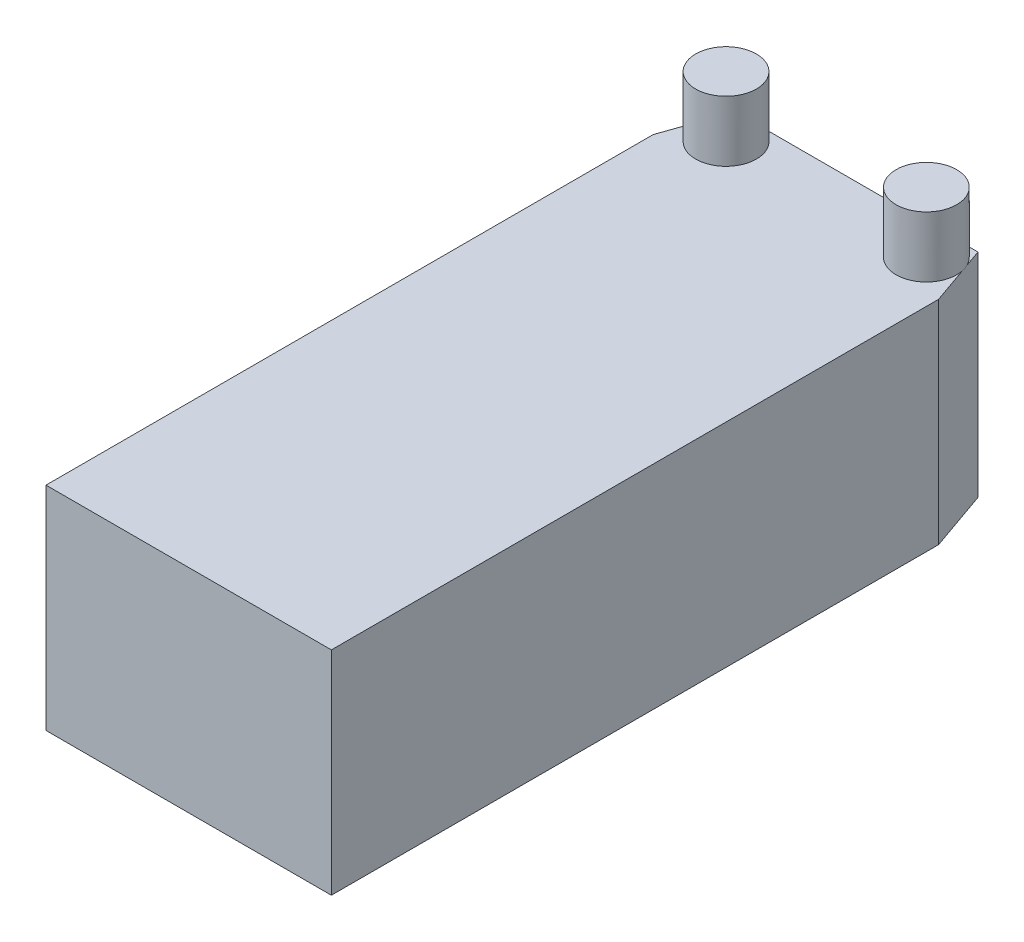
ISO-10303-21;
HEADER;
FILE_DESCRIPTION(('STEP AP214'),'2;1');
FILE_NAME('part.step','',(''),(''),'','','');
FILE_SCHEMA(('AUTOMOTIVE_DESIGN { 1 0 10303 214 1 1 1 1 }'));
ENDSEC;
DATA;
#1=APPLICATION_CONTEXT('core data for automotive mechanical design processes');
#2=APPLICATION_PROTOCOL_DEFINITION('international standard','automotive_design',2000,#1);
#3=PRODUCT_CONTEXT('',#1,'mechanical');
#4=PRODUCT('Part','Part','',(#3));
#5=PRODUCT_RELATED_PRODUCT_CATEGORY('part','',(#4));
#6=PRODUCT_DEFINITION_FORMATION('','',#4);
#7=PRODUCT_DEFINITION_CONTEXT('part definition',#1,'design');
#8=PRODUCT_DEFINITION('design','',#6,#7);
#9=PRODUCT_DEFINITION_SHAPE('','',#8);
#10=(LENGTH_UNIT() NAMED_UNIT(*) SI_UNIT(.MILLI.,.METRE.));
#11=(NAMED_UNIT(*) PLANE_ANGLE_UNIT() SI_UNIT($,.RADIAN.));
#12=(NAMED_UNIT(*) SI_UNIT($,.STERADIAN.) SOLID_ANGLE_UNIT());
#13=UNCERTAINTY_MEASURE_WITH_UNIT(LENGTH_MEASURE(1.E-05),#10,'distance_accuracy_value','');
#14=(GEOMETRIC_REPRESENTATION_CONTEXT(3) GLOBAL_UNCERTAINTY_ASSIGNED_CONTEXT((#13)) GLOBAL_UNIT_ASSIGNED_CONTEXT((#10,
#11,#12)) REPRESENTATION_CONTEXT('',''));
#15=CARTESIAN_POINT('',(0.,0.,0.));
#16=DIRECTION('',(0.,0.,1.));
#17=DIRECTION('',(1.,0.,0.));
#18=AXIS2_PLACEMENT_3D('',#15,#16,#17);
#19=CARTESIAN_POINT('',(0.,35.,0.));
#20=DIRECTION('',(0.,1.,0.));
#21=DIRECTION('',(0.,0.,1.));
#22=AXIS2_PLACEMENT_3D('',#19,#20,#21);
#23=PLANE('',#22);
#24=DIRECTION('',(-1.,0.,0.));
#25=VECTOR('',#24,1.);
#26=CARTESIAN_POINT('',(-20.,35.,-60.));
#27=LINE('',#26,#25);
#28=CARTESIAN_POINT('',(20.,35.,-60.));
#29=VERTEX_POINT('',#28);
#30=CARTESIAN_POINT('',(16.5,35.,-60.));
#31=VERTEX_POINT('',#30);
#32=EDGE_CURVE('E130',#29,#31,#27,.T.);
#33=ORIENTED_EDGE('',*,*,#32,.T.);
#34=CARTESIAN_POINT('',(16.5,35.,-55.));
#35=DIRECTION('',(0.,1.,0.));
#36=DIRECTION('',(0.,0.,1.));
#37=AXIS2_PLACEMENT_3D('',#34,#35,#36);
#38=CIRCLE('',#37,5.);
#39=CARTESIAN_POINT('',(20.9565814045298,35.,-57.266910272772));
#40=VERTEX_POINT('',#39);
#41=EDGE_CURVE('E11',#31,#40,#38,.F.);
#42=ORIENTED_EDGE('',*,*,#41,.T.);
#43=DIRECTION('',(-0.330350424728106,0.,-0.943858356366017));
#44=VECTOR('',#43,1.);
#45=CARTESIAN_POINT('',(20.,35.,-60.));
#46=LINE('',#45,#44);
#47=EDGE_CURVE('E121',#40,#29,#46,.T.);
#48=ORIENTED_EDGE('',*,*,#47,.T.);
#49=EDGE_LOOP('',(#33,#42,#48));
#50=FACE_BOUND('',#49,.T.);
#51=ADVANCED_FACE('F36',(#50),#23,.T.);
#52=CARTESIAN_POINT('',(-16.5,35.,-55.));
#53=DIRECTION('',(0.,1.,0.));
#54=DIRECTION('',(0.,0.,1.));
#55=AXIS2_PLACEMENT_3D('',#52,#53,#54);
#56=CIRCLE('',#55,5.);
#57=CARTESIAN_POINT('',(-16.5,35.,-60.));
#58=VERTEX_POINT('',#57);
#59=CARTESIAN_POINT('',(-20.9565814045298,35.,-57.266910272772));
#60=VERTEX_POINT('',#59);
#61=EDGE_CURVE('E160',#58,#60,#56,.T.);
#62=ORIENTED_EDGE('',*,*,#61,.F.);
#63=CARTESIAN_POINT('',(-20.,35.,-60.));
#64=VERTEX_POINT('',#63);
#65=EDGE_CURVE('E127',#58,#64,#27,.T.);
#66=ORIENTED_EDGE('',*,*,#65,.T.);
#67=DIRECTION('',(-0.330350424728106,0.,0.943858356366017));
#68=VECTOR('',#67,1.);
#69=CARTESIAN_POINT('',(-23.5,35.,-50.));
#70=LINE('',#69,#68);
#71=EDGE_CURVE('E206',#64,#60,#70,.T.);
#72=ORIENTED_EDGE('',*,*,#71,.T.);
#73=EDGE_LOOP('',(#62,#66,#72));
#74=FACE_BOUND('',#73,.T.);
#75=ADVANCED_FACE('F215',(#74),#23,.T.);
#76=CARTESIAN_POINT('',(20.,35.,-60.));
#77=DIRECTION('',(-0.943858356366017,0.,0.330350424728106));
#78=DIRECTION('',(0.330350424728106,0.,0.943858356366018));
#79=AXIS2_PLACEMENT_3D('',#76,#77,#78);
#80=PLANE('',#79);
#81=DIRECTION('',(-0.330350424728106,0.,-0.943858356366017));
#82=VECTOR('',#81,1.);
#83=CARTESIAN_POINT('',(20.,0.,-60.));
#84=LINE('',#83,#82);
#85=CARTESIAN_POINT('',(23.5,0.,-50.));
#86=VERTEX_POINT('',#85);
#87=CARTESIAN_POINT('',(20.,0.,-60.));
#88=VERTEX_POINT('',#87);
#89=EDGE_CURVE('E173',#86,#88,#84,.T.);
#90=ORIENTED_EDGE('',*,*,#89,.T.);
#91=DIRECTION('',(0.,-1.,0.));
#92=VECTOR('',#91,1.);
#93=CARTESIAN_POINT('',(20.,35.,-60.));
#94=LINE('',#93,#92);
#95=EDGE_CURVE('E157',#29,#88,#94,.T.);
#96=ORIENTED_EDGE('',*,*,#95,.F.);
#97=ORIENTED_EDGE('',*,*,#47,.F.);
#98=CARTESIAN_POINT('',(21.3975388627308,35.,-56.0070318207692));
#99=VERTEX_POINT('',#98);
#100=EDGE_CURVE('E111',#99,#40,#46,.T.);
#101=ORIENTED_EDGE('',*,*,#100,.F.);
#102=CARTESIAN_POINT('',(23.5,35.,-50.));
#103=VERTEX_POINT('',#102);
#104=EDGE_CURVE('E119',#103,#99,#46,.T.);
#105=ORIENTED_EDGE('',*,*,#104,.F.);
#106=DIRECTION('',(0.,-1.,0.));
#107=VECTOR('',#106,1.);
#108=CARTESIAN_POINT('',(23.5,35.,-50.));
#109=LINE('',#108,#107);
#110=EDGE_CURVE('E145',#103,#86,#109,.T.);
#111=ORIENTED_EDGE('',*,*,#110,.T.);
#112=EDGE_LOOP('',(#90,#96,#97,#101,#105,#111));
#113=FACE_BOUND('',#112,.T.);
#114=ADVANCED_FACE('F38',(#113),#80,.F.);
#115=CARTESIAN_POINT('',(-20.,35.,-60.));
#116=DIRECTION('',(0.,0.,1.));
#117=DIRECTION('',(1.,0.,0.));
#118=AXIS2_PLACEMENT_3D('',#115,#116,#117);
#119=PLANE('',#118);
#120=DIRECTION('',(-1.,0.,0.));
#121=VECTOR('',#120,1.);
#122=CARTESIAN_POINT('',(-20.,0.,-60.));
#123=LINE('',#122,#121);
#124=CARTESIAN_POINT('',(-20.,0.,-60.));
#125=VERTEX_POINT('',#124);
#126=EDGE_CURVE('E176',#88,#125,#123,.T.);
#127=ORIENTED_EDGE('',*,*,#126,.T.);
#128=DIRECTION('',(0.,-1.,0.));
#129=VECTOR('',#128,1.);
#130=CARTESIAN_POINT('',(-20.,35.,-60.));
#131=LINE('',#130,#129);
#132=EDGE_CURVE('E155',#64,#125,#131,.T.);
#133=ORIENTED_EDGE('',*,*,#132,.F.);
#134=ORIENTED_EDGE('',*,*,#65,.F.);
#135=EDGE_CURVE('E128',#31,#58,#27,.T.);
#136=ORIENTED_EDGE('',*,*,#135,.F.);
#137=ORIENTED_EDGE('',*,*,#32,.F.);
#138=ORIENTED_EDGE('',*,*,#95,.T.);
#139=EDGE_LOOP('',(#127,#133,#134,#136,#137,#138));
#140=FACE_BOUND('',#139,.T.);
#141=ADVANCED_FACE('F200',(#140),#119,.F.);
#142=CARTESIAN_POINT('',(-23.5,35.,-50.));
#143=DIRECTION('',(0.943858356366017,0.,0.330350424728106));
#144=DIRECTION('',(0.330350424728106,0.,-0.943858356366018));
#145=AXIS2_PLACEMENT_3D('',#142,#143,#144);
#146=PLANE('',#145);
#147=DIRECTION('',(-0.330350424728106,0.,0.943858356366017));
#148=VECTOR('',#147,1.);
#149=CARTESIAN_POINT('',(-23.5,0.,-50.));
#150=LINE('',#149,#148);
#151=CARTESIAN_POINT('',(-23.5,0.,-50.));
#152=VERTEX_POINT('',#151);
#153=EDGE_CURVE('E179',#125,#152,#150,.T.);
#154=ORIENTED_EDGE('',*,*,#153,.T.);
#155=DIRECTION('',(0.,-1.,0.));
#156=VECTOR('',#155,1.);
#157=CARTESIAN_POINT('',(-23.5,35.,-50.));
#158=LINE('',#157,#156);
#159=CARTESIAN_POINT('',(-23.5,35.,-50.));
#160=VERTEX_POINT('',#159);
#161=EDGE_CURVE('E152',#160,#152,#158,.T.);
#162=ORIENTED_EDGE('',*,*,#161,.F.);
#163=CARTESIAN_POINT('',(-21.3975388627308,35.,-56.0070318207692));
#164=VERTEX_POINT('',#163);
#165=EDGE_CURVE('E213',#164,#160,#70,.T.);
#166=ORIENTED_EDGE('',*,*,#165,.F.);
#167=EDGE_CURVE('E208',#60,#164,#70,.T.);
#168=ORIENTED_EDGE('',*,*,#167,.F.);
#169=ORIENTED_EDGE('',*,*,#71,.F.);
#170=ORIENTED_EDGE('',*,*,#132,.T.);
#171=EDGE_LOOP('',(#154,#162,#166,#168,#169,#170));
#172=FACE_BOUND('',#171,.T.);
#173=ADVANCED_FACE('F204',(#172),#146,.F.);
#174=CARTESIAN_POINT('',(-23.5,35.,50.));
#175=DIRECTION('',(1.,0.,0.));
#176=DIRECTION('',(0.,0.,-1.));
#177=AXIS2_PLACEMENT_3D('',#174,#175,#176);
#178=PLANE('',#177);
#179=DIRECTION('',(0.,0.,1.));
#180=VECTOR('',#179,1.);
#181=CARTESIAN_POINT('',(-23.5,0.,50.));
#182=LINE('',#181,#180);
#183=CARTESIAN_POINT('',(-23.5,0.,50.));
#184=VERTEX_POINT('',#183);
#185=EDGE_CURVE('E141',#152,#184,#182,.T.);
#186=ORIENTED_EDGE('',*,*,#185,.T.);
#187=DIRECTION('',(0.,-1.,0.));
#188=VECTOR('',#187,1.);
#189=CARTESIAN_POINT('',(-23.5,35.,50.));
#190=LINE('',#189,#188);
#191=CARTESIAN_POINT('',(-23.5,35.,50.));
#192=VERTEX_POINT('',#191);
#193=EDGE_CURVE('E149',#192,#184,#190,.T.);
#194=ORIENTED_EDGE('',*,*,#193,.F.);
#195=DIRECTION('',(0.,0.,1.));
#196=VECTOR('',#195,1.);
#197=CARTESIAN_POINT('',(-23.5,35.,50.));
#198=LINE('',#197,#196);
#199=EDGE_CURVE('E211',#160,#192,#198,.T.);
#200=ORIENTED_EDGE('',*,*,#199,.F.);
#201=ORIENTED_EDGE('',*,*,#161,.T.);
#202=EDGE_LOOP('',(#186,#194,#200,#201));
#203=FACE_BOUND('',#202,.T.);
#204=ADVANCED_FACE('F187',(#203),#178,.F.);
#205=CARTESIAN_POINT('',(-23.5,35.,50.));
#206=DIRECTION('',(0.,0.,-1.));
#207=DIRECTION('',(-1.,0.,0.));
#208=AXIS2_PLACEMENT_3D('',#205,#206,#207);
#209=PLANE('',#208);
#210=DIRECTION('',(1.,0.,0.));
#211=VECTOR('',#210,1.);
#212=CARTESIAN_POINT('',(-23.5,0.,50.));
#213=LINE('',#212,#211);
#214=CARTESIAN_POINT('',(23.5,0.,50.));
#215=VERTEX_POINT('',#214);
#216=EDGE_CURVE('E136',#184,#215,#213,.T.);
#217=ORIENTED_EDGE('',*,*,#216,.T.);
#218=DIRECTION('',(0.,-1.,0.));
#219=VECTOR('',#218,1.);
#220=CARTESIAN_POINT('',(23.5,35.,50.));
#221=LINE('',#220,#219);
#222=CARTESIAN_POINT('',(23.5,35.,50.));
#223=VERTEX_POINT('',#222);
#224=EDGE_CURVE('E147',#223,#215,#221,.T.);
#225=ORIENTED_EDGE('',*,*,#224,.F.);
#226=DIRECTION('',(1.,0.,0.));
#227=VECTOR('',#226,1.);
#228=CARTESIAN_POINT('',(-23.5,35.,50.));
#229=LINE('',#228,#227);
#230=EDGE_CURVE('E197',#192,#223,#229,.T.);
#231=ORIENTED_EDGE('',*,*,#230,.F.);
#232=ORIENTED_EDGE('',*,*,#193,.T.);
#233=EDGE_LOOP('',(#217,#225,#231,#232));
#234=FACE_BOUND('',#233,.T.);
#235=ADVANCED_FACE('F195',(#234),#209,.F.);
#236=CARTESIAN_POINT('',(23.5,35.,50.));
#237=DIRECTION('',(-1.,0.,0.));
#238=DIRECTION('',(0.,0.,1.));
#239=AXIS2_PLACEMENT_3D('',#236,#237,#238);
#240=PLANE('',#239);
#241=DIRECTION('',(0.,0.,-1.));
#242=VECTOR('',#241,1.);
#243=CARTESIAN_POINT('',(23.5,0.,50.));
#244=LINE('',#243,#242);
#245=EDGE_CURVE('E132',#215,#86,#244,.T.);
#246=ORIENTED_EDGE('',*,*,#245,.T.);
#247=ORIENTED_EDGE('',*,*,#110,.F.);
#248=DIRECTION('',(0.,0.,-1.));
#249=VECTOR('',#248,1.);
#250=CARTESIAN_POINT('',(23.5,35.,50.));
#251=LINE('',#250,#249);
#252=EDGE_CURVE('E125',#223,#103,#251,.T.);
#253=ORIENTED_EDGE('',*,*,#252,.F.);
#254=ORIENTED_EDGE('',*,*,#224,.T.);
#255=EDGE_LOOP('',(#246,#247,#253,#254));
#256=FACE_BOUND('',#255,.T.);
#257=ADVANCED_FACE('F236',(#256),#240,.F.);
#258=ORIENTED_EDGE('',*,*,#104,.T.);
#259=EDGE_CURVE('E40',#99,#31,#38,.F.);
#260=ORIENTED_EDGE('',*,*,#259,.T.);
#261=ORIENTED_EDGE('',*,*,#135,.T.);
#262=EDGE_CURVE('E57',#164,#58,#56,.T.);
#263=ORIENTED_EDGE('',*,*,#262,.F.);
#264=ORIENTED_EDGE('',*,*,#165,.T.);
#265=ORIENTED_EDGE('',*,*,#199,.T.);
#266=ORIENTED_EDGE('',*,*,#230,.T.);
#267=ORIENTED_EDGE('',*,*,#252,.T.);
#268=EDGE_LOOP('',(#258,#260,#261,#263,#264,#265,#266,#267));
#269=FACE_BOUND('',#268,.T.);
#270=ADVANCED_FACE('F123',(#269),#23,.T.);
#271=CARTESIAN_POINT('',(0.,0.,0.));
#272=DIRECTION('',(0.,1.,0.));
#273=DIRECTION('',(0.,0.,1.));
#274=AXIS2_PLACEMENT_3D('',#271,#272,#273);
#275=PLANE('',#274);
#276=ORIENTED_EDGE('',*,*,#89,.F.);
#277=ORIENTED_EDGE('',*,*,#245,.F.);
#278=ORIENTED_EDGE('',*,*,#216,.F.);
#279=ORIENTED_EDGE('',*,*,#185,.F.);
#280=ORIENTED_EDGE('',*,*,#153,.F.);
#281=ORIENTED_EDGE('',*,*,#126,.F.);
#282=EDGE_LOOP('',(#276,#277,#278,#279,#280,#281));
#283=FACE_BOUND('',#282,.T.);
#284=ADVANCED_FACE('F198',(#283),#275,.F.);
#285=CARTESIAN_POINT('',(-16.5,35.,-55.));
#286=DIRECTION('',(0.,1.,0.));
#287=DIRECTION('',(0.,0.,1.));
#288=AXIS2_PLACEMENT_3D('',#285,#286,#287);
#289=PLANE('',#288);
#290=EDGE_CURVE('E161',#60,#164,#56,.T.);
#291=ORIENTED_EDGE('',*,*,#290,.F.);
#292=ORIENTED_EDGE('',*,*,#167,.T.);
#293=EDGE_LOOP('',(#291,#292));
#294=FACE_BOUND('',#293,.T.);
#295=ADVANCED_FACE('F219',(#294),#289,.F.);
#296=CARTESIAN_POINT('',(-16.5,45.,-55.));
#297=DIRECTION('',(0.,-1.,0.));
#298=DIRECTION('',(0.,0.,-1.));
#299=AXIS2_PLACEMENT_3D('',#296,#297,#298);
#300=CYLINDRICAL_SURFACE('',#299,5.);
#301=CARTESIAN_POINT('',(-16.5,45.,-55.));
#302=DIRECTION('',(0.,1.,0.));
#303=DIRECTION('',(0.,0.,1.));
#304=AXIS2_PLACEMENT_3D('',#301,#302,#303);
#305=CIRCLE('',#304,5.);
#306=CARTESIAN_POINT('',(-16.5,45.,-50.));
#307=VERTEX_POINT('',#306);
#308=EDGE_CURVE('E166',#307,#307,#305,.T.);
#309=ORIENTED_EDGE('',*,*,#308,.F.);
#310=EDGE_LOOP('',(#309));
#311=FACE_BOUND('',#310,.T.);
#312=ORIENTED_EDGE('',*,*,#61,.T.);
#313=ORIENTED_EDGE('',*,*,#290,.T.);
#314=ORIENTED_EDGE('',*,*,#262,.T.);
#315=EDGE_LOOP('',(#312,#313,#314));
#316=FACE_BOUND('',#315,.T.);
#317=ADVANCED_FACE('F216',(#311,#316),#300,.T.);
#318=CARTESIAN_POINT('',(-16.5,45.,-55.));
#319=DIRECTION('',(0.,1.,0.));
#320=DIRECTION('',(0.,0.,1.));
#321=AXIS2_PLACEMENT_3D('',#318,#319,#320);
#322=PLANE('',#321);
#323=ORIENTED_EDGE('',*,*,#308,.T.);
#324=EDGE_LOOP('',(#323));
#325=FACE_BOUND('',#324,.T.);
#326=ADVANCED_FACE('F218',(#325),#322,.T.);
#327=CARTESIAN_POINT('',(16.5,35.,-55.));
#328=DIRECTION('',(0.,1.,0.));
#329=DIRECTION('',(0.,0.,1.));
#330=AXIS2_PLACEMENT_3D('',#327,#328,#329);
#331=PLANE('',#330);
#332=CARTESIAN_POINT('',(16.5,35.,-55.));
#333=DIRECTION('',(0.,1.,0.));
#334=DIRECTION('',(0.,0.,1.));
#335=AXIS2_PLACEMENT_3D('',#332,#333,#334);
#336=CIRCLE('',#335,5.);
#337=EDGE_CURVE('E105',#99,#40,#336,.T.);
#338=ORIENTED_EDGE('',*,*,#337,.F.);
#339=ORIENTED_EDGE('',*,*,#100,.T.);
#340=EDGE_LOOP('',(#338,#339));
#341=FACE_BOUND('',#340,.T.);
#342=ADVANCED_FACE('F110',(#341),#331,.F.);
#343=CARTESIAN_POINT('',(16.5,45.,-55.));
#344=DIRECTION('',(0.,-1.,0.));
#345=DIRECTION('',(0.,0.,-1.));
#346=AXIS2_PLACEMENT_3D('',#343,#344,#345);
#347=CYLINDRICAL_SURFACE('',#346,5.);
#348=CARTESIAN_POINT('',(16.5,45.,-55.));
#349=DIRECTION('',(0.,1.,0.));
#350=DIRECTION('',(0.,0.,1.));
#351=AXIS2_PLACEMENT_3D('',#348,#349,#350);
#352=CIRCLE('',#351,5.);
#353=CARTESIAN_POINT('',(16.5,45.,-50.));
#354=VERTEX_POINT('',#353);
#355=EDGE_CURVE('E112',#354,#354,#352,.T.);
#356=ORIENTED_EDGE('',*,*,#355,.F.);
#357=EDGE_LOOP('',(#356));
#358=FACE_BOUND('',#357,.T.);
#359=ORIENTED_EDGE('',*,*,#337,.T.);
#360=ORIENTED_EDGE('',*,*,#41,.F.);
#361=ORIENTED_EDGE('',*,*,#259,.F.);
#362=EDGE_LOOP('',(#359,#360,#361));
#363=FACE_BOUND('',#362,.T.);
#364=ADVANCED_FACE('F104',(#358,#363),#347,.T.);
#365=CARTESIAN_POINT('',(16.5,45.,-55.));
#366=DIRECTION('',(0.,1.,0.));
#367=DIRECTION('',(0.,0.,1.));
#368=AXIS2_PLACEMENT_3D('',#365,#366,#367);
#369=PLANE('',#368);
#370=ORIENTED_EDGE('',*,*,#355,.T.);
#371=EDGE_LOOP('',(#370));
#372=FACE_BOUND('',#371,.T.);
#373=ADVANCED_FACE('F333',(#372),#369,.T.);
#374=CLOSED_SHELL('',(#51,#75,#114,#141,#173,#204,#235,#257,#270,#284,#295,#317,#326,#342,#364,#373));
#375=MANIFOLD_SOLID_BREP('B2',#374);
#376=ADVANCED_BREP_SHAPE_REPRESENTATION('',(#18,#375),#14);
#377=SHAPE_DEFINITION_REPRESENTATION(#9,#376);
ENDSEC;
END-ISO-10303-21;
